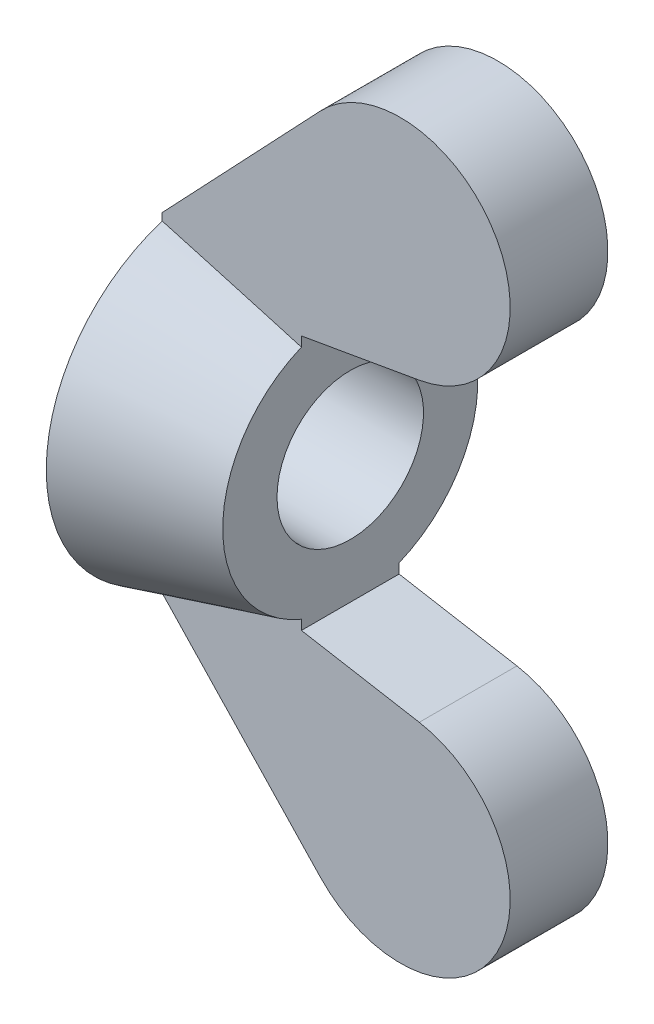
ISO-10303-21;
HEADER;
FILE_DESCRIPTION(('STEP AP214'),'2;1');
FILE_NAME('part.step','',(''),(''),'','','');
FILE_SCHEMA(('AUTOMOTIVE_DESIGN { 1 0 10303 214 1 1 1 1 }'));
ENDSEC;
DATA;
#1=APPLICATION_CONTEXT('core data for automotive mechanical design processes');
#2=APPLICATION_PROTOCOL_DEFINITION('international standard','automotive_design',2000,#1);
#3=PRODUCT_CONTEXT('',#1,'mechanical');
#4=PRODUCT('Part','Part','',(#3));
#5=PRODUCT_RELATED_PRODUCT_CATEGORY('part','',(#4));
#6=PRODUCT_DEFINITION_FORMATION('','',#4);
#7=PRODUCT_DEFINITION_CONTEXT('part definition',#1,'design');
#8=PRODUCT_DEFINITION('design','',#6,#7);
#9=PRODUCT_DEFINITION_SHAPE('','',#8);
#10=(LENGTH_UNIT() NAMED_UNIT(*) SI_UNIT(.MILLI.,.METRE.));
#11=(NAMED_UNIT(*) PLANE_ANGLE_UNIT() SI_UNIT($,.RADIAN.));
#12=(NAMED_UNIT(*) SI_UNIT($,.STERADIAN.) SOLID_ANGLE_UNIT());
#13=UNCERTAINTY_MEASURE_WITH_UNIT(LENGTH_MEASURE(1.E-05),#10,'distance_accuracy_value','');
#14=(GEOMETRIC_REPRESENTATION_CONTEXT(3) GLOBAL_UNCERTAINTY_ASSIGNED_CONTEXT((#13)) GLOBAL_UNIT_ASSIGNED_CONTEXT((#10,
#11,#12)) REPRESENTATION_CONTEXT('',''));
#15=CARTESIAN_POINT('',(0.,0.,0.));
#16=DIRECTION('',(0.,0.,1.));
#17=DIRECTION('',(1.,0.,0.));
#18=AXIS2_PLACEMENT_3D('',#15,#16,#17);
#19=CARTESIAN_POINT('',(3.8,0.,0.));
#20=DIRECTION('',(-1.,0.,0.));
#21=DIRECTION('',(0.,0.,1.));
#22=AXIS2_PLACEMENT_3D('',#19,#20,#21);
#23=CONICAL_SURFACE('',#22,3.48179306876172,0.261799387799153);
#24=CARTESIAN_POINT('',(7.1882117066717,-2.20166060998559,1.33333333333333));
#25=CARTESIAN_POINT('',(7.02558211755386,-2.25259908587351,1.33333333333333));
#26=CARTESIAN_POINT('',(6.86282154843142,-2.30311690747788,1.33333333333333));
#27=CARTESIAN_POINT('',(6.53708112087365,-2.40343743756326,1.33333333333333));
#28=CARTESIAN_POINT('',(6.37410126373637,-2.4532401502571,1.33333333333333));
#29=CARTESIAN_POINT('',(5.88490037565497,-2.60176383814586,1.33333333333333));
#30=CARTESIAN_POINT('',(5.55841155409289,-2.69960237979792,1.33333333333333));
#31=CARTESIAN_POINT('',(4.90494682473719,-2.89357754729106,1.33333333333333));
#32=CARTESIAN_POINT('',(4.57797094049598,-2.98971425270385,1.33333333333333));
#33=CARTESIAN_POINT('',(3.9236451852113,-3.18071175318779,1.33333333333333));
#34=CARTESIAN_POINT('',(3.59629531214881,-3.27557254133513,1.33333333333333));
#35=CARTESIAN_POINT('',(2.81627585629879,-3.5003443113003,1.33333333333333));
#36=CARTESIAN_POINT('',(2.36347786807294,-3.62980934352791,1.33333333333333));
#37=CARTESIAN_POINT('',(1.45748991428026,-3.88738779535643,1.33333333333333));
#38=CARTESIAN_POINT('',(1.00429994220263,-4.01550119202155,1.33333333333333));
#39=CARTESIAN_POINT('',(-0.00374594693617139,-4.29924991744796,1.33333333333333));
#40=CARTESIAN_POINT('',(-0.558672864959987,-4.45463287258272,1.33333333333333));
#41=CARTESIAN_POINT('',(-1.66883544088799,-4.764292907989,1.33333333333333));
#42=CARTESIAN_POINT('',(-2.22407109908928,-4.91856998719429,1.33333333333333));
#43=CARTESIAN_POINT('',(-3.3347443854926,-5.22628496866582,1.33333333333333));
#44=CARTESIAN_POINT('',(-3.89018200199174,-5.37972291319578,1.33333333333333));
#45=CARTESIAN_POINT('',(-5.00123577244357,-5.68594544421749,1.33333333333333));
#46=CARTESIAN_POINT('',(-5.5568519259219,-5.83873003242991,1.33333333333333));
#47=CARTESIAN_POINT('',(-6.1125329906275,-5.99127730226936,1.33333333333333));
#48=B_SPLINE_CURVE_WITH_KNOTS('',3,(#24,#25,#26,#27,#28,#29,#30,#31,#32,#33,#34,#35,#36,#37,#38,
#39,#40,#41,#42,#43,#44,#45,#46,#47),.UNSPECIFIED.,.F.,.F.,(4,2,2,2,2,2,2,2,2,2,2,4),(0.,
0.511259509858175,1.02251600655328,2.04500865819224,3.06745337483093,4.08990363756909,
5.50272920709677,6.91557871230514,8.64438868894977,10.3732003321999,12.1019240853529,
13.8306432829557),.UNSPECIFIED.);
#49=CARTESIAN_POINT('',(3.8,-3.21638076040436,1.33333333333333));
#50=VERTEX_POINT('',#49);
#51=CARTESIAN_POINT('',(0.,-4.29793231940921,1.33333333333333));
#52=VERTEX_POINT('',#51);
#53=EDGE_CURVE('E143',#50,#52,#48,.T.);
#54=ORIENTED_EDGE('',*,*,#53,.F.);
#55=CARTESIAN_POINT('',(3.8,0.,0.));
#56=DIRECTION('',(-1.,0.,0.));
#57=DIRECTION('',(0.,0.,1.));
#58=AXIS2_PLACEMENT_3D('',#55,#56,#57);
#59=CIRCLE('',#58,3.48179306876172);
#60=CARTESIAN_POINT('',(3.8,3.21638076040436,1.33333333333333));
#61=VERTEX_POINT('',#60);
#62=EDGE_CURVE('E226',#50,#61,#59,.T.);
#63=ORIENTED_EDGE('',*,*,#62,.T.);
#64=CARTESIAN_POINT('',(-6.1125329906275,5.99127730226936,1.33333333333333));
#65=CARTESIAN_POINT('',(-5.55682310824559,5.83872217826183,1.33333333333333));
#66=CARTESIAN_POINT('',(-5.00117816850263,5.68592963226838,1.33333333333333));
#67=CARTESIAN_POINT('',(-3.89006799025682,5.37969142432419,1.33333333333333));
#68=CARTESIAN_POINT('',(-3.33460275185776,5.22624576199691,1.33333333333333));
#69=CARTESIAN_POINT('',(-2.22393165809083,4.9185313217443,1.33333333333333));
#70=CARTESIAN_POINT('',(-1.66872579061138,4.76426258755969,1.33333333333333));
#71=CARTESIAN_POINT('',(-0.558619758017499,4.45461779454218,1.33333333333333));
#72=CARTESIAN_POINT('',(-0.00371959439113799,4.29924173036955,1.33333333333333));
#73=CARTESIAN_POINT('',(1.10568997020868,3.98696229708887,1.33333333333333));
#74=CARTESIAN_POINT('',(1.66019934348916,3.83005882952868,1.33333333333333));
#75=CARTESIAN_POINT('',(2.76859928073843,3.51409904821436,1.33333333333333));
#76=CARTESIAN_POINT('',(3.32248985178853,3.35504275937511,1.33333333333333));
#77=CARTESIAN_POINT('',(4.15263119557657,3.11400214875473,1.33333333333333));
#78=CARTESIAN_POINT('',(4.42923763244079,3.03324342044457,1.33333333333333));
#79=CARTESIAN_POINT('',(4.98214229109042,2.87068166747203,1.33333333333333));
#80=CARTESIAN_POINT('',(5.25844051429898,2.7888786476535,1.33333333333333));
#81=CARTESIAN_POINT('',(5.81065153619272,2.62393916667967,1.33333333333333));
#82=CARTESIAN_POINT('',(6.08656431947965,2.54080265381929,1.33333333333333));
#83=CARTESIAN_POINT('',(6.63784053807137,2.37271402559638,1.33333333333333));
#84=CARTESIAN_POINT('',(6.91320396450202,2.28776188116024,1.33333333333333));
#85=CARTESIAN_POINT('',(7.1882117066717,2.20166060998559,1.33333333333333));
#86=B_SPLINE_CURVE_WITH_KNOTS('',3,(#64,#65,#66,#67,#68,#69,#70,#71,#72,#73,#74,#75,#76,#77,#78,
#79,#80,#81,#82,#83,#84,#85),.UNSPECIFIED.,.F.,.F.,(4,2,2,2,2,2,2,2,2,2,4),(0.,1.72880879815737,
3.45761859318671,5.18633741103185,6.91506457069138,8.64390390695709,10.3727232522224,
11.2371855449363,12.101643829372,12.9661357138843,13.8306414518526),.UNSPECIFIED.);
#87=CARTESIAN_POINT('',(0.,4.29793231940921,1.33333333333333));
#88=VERTEX_POINT('',#87);
#89=EDGE_CURVE('E211',#88,#61,#86,.T.);
#90=ORIENTED_EDGE('',*,*,#89,.F.);
#91=CARTESIAN_POINT('',(0.,0.,0.));
#92=DIRECTION('',(-1.,0.,0.));
#93=DIRECTION('',(0.,0.,1.));
#94=AXIS2_PLACEMENT_3D('',#91,#92,#93);
#95=CIRCLE('',#94,4.5);
#96=EDGE_CURVE('E229',#52,#88,#95,.T.);
#97=ORIENTED_EDGE('',*,*,#96,.F.);
#98=EDGE_LOOP('',(#54,#63,#90,#97));
#99=FACE_BOUND('',#98,.T.);
#100=ADVANCED_FACE('F34',(#99),#23,.T.);
#101=CARTESIAN_POINT('',(3.8,3.21638076040436,-1.33333333333333));
#102=VERTEX_POINT('',#101);
#103=CARTESIAN_POINT('',(3.8,-3.21638076040436,-1.33333333333333));
#104=VERTEX_POINT('',#103);
#105=EDGE_CURVE('E227',#102,#104,#59,.T.);
#106=ORIENTED_EDGE('',*,*,#105,.T.);
#107=CARTESIAN_POINT('',(7.1882117066717,-2.20166060998559,-1.33333333333333));
#108=CARTESIAN_POINT('',(7.02558211755386,-2.25259908587351,-1.33333333333333));
#109=CARTESIAN_POINT('',(6.86282154843142,-2.30311690747788,-1.33333333333333));
#110=CARTESIAN_POINT('',(6.53708112087365,-2.40343743756326,-1.33333333333333));
#111=CARTESIAN_POINT('',(6.37410126373637,-2.4532401502571,-1.33333333333333));
#112=CARTESIAN_POINT('',(5.88490037565497,-2.60176383814586,-1.33333333333333));
#113=CARTESIAN_POINT('',(5.55841155409289,-2.69960237979792,-1.33333333333333));
#114=CARTESIAN_POINT('',(4.90494682473719,-2.89357754729106,-1.33333333333333));
#115=CARTESIAN_POINT('',(4.57797094049598,-2.98971425270385,-1.33333333333333));
#116=CARTESIAN_POINT('',(3.9236451852113,-3.18071175318779,-1.33333333333333));
#117=CARTESIAN_POINT('',(3.59629531214881,-3.27557254133513,-1.33333333333333));
#118=CARTESIAN_POINT('',(2.81627585629879,-3.5003443113003,-1.33333333333333));
#119=CARTESIAN_POINT('',(2.36347786807294,-3.62980934352791,-1.33333333333333));
#120=CARTESIAN_POINT('',(1.45748991428026,-3.88738779535643,-1.33333333333333));
#121=CARTESIAN_POINT('',(1.00429994220263,-4.01550119202155,-1.33333333333333));
#122=CARTESIAN_POINT('',(-0.00374594693617139,-4.29924991744796,-1.33333333333333));
#123=CARTESIAN_POINT('',(-0.558672864959987,-4.45463287258272,-1.33333333333333));
#124=CARTESIAN_POINT('',(-1.66883544088799,-4.764292907989,-1.33333333333333));
#125=CARTESIAN_POINT('',(-2.22407109908928,-4.91856998719429,-1.33333333333333));
#126=CARTESIAN_POINT('',(-3.3347443854926,-5.22628496866582,-1.33333333333333));
#127=CARTESIAN_POINT('',(-3.89018200199174,-5.37972291319578,-1.33333333333333));
#128=CARTESIAN_POINT('',(-5.00123577244357,-5.68594544421749,-1.33333333333333));
#129=CARTESIAN_POINT('',(-5.5568519259219,-5.83873003242991,-1.33333333333333));
#130=CARTESIAN_POINT('',(-6.1125329906275,-5.99127730226936,-1.33333333333333));
#131=B_SPLINE_CURVE_WITH_KNOTS('',3,(#107,#108,#109,#110,#111,#112,#113,#114,#115,#116,#117,
#118,#119,#120,#121,#122,#123,#124,#125,#126,#127,#128,#129,#130),.UNSPECIFIED.,.F.,.F.,(4,2,2,
2,2,2,2,2,2,2,2,4),(0.,0.511259509858175,1.02251600655328,2.04500865819224,3.06745337483093,
4.08990363756909,5.50272920709677,6.91557871230514,8.64438868894977,10.3732003321999,
12.1019240853529,13.8306432829557),.UNSPECIFIED.);
#132=CARTESIAN_POINT('',(0.,-4.29793231940921,-1.33333333333333));
#133=VERTEX_POINT('',#132);
#134=EDGE_CURVE('E133',#104,#133,#131,.T.);
#135=ORIENTED_EDGE('',*,*,#134,.T.);
#136=CARTESIAN_POINT('',(0.,4.29793231940921,-1.33333333333333));
#137=VERTEX_POINT('',#136);
#138=EDGE_CURVE('E42',#137,#133,#95,.T.);
#139=ORIENTED_EDGE('',*,*,#138,.F.);
#140=CARTESIAN_POINT('',(-6.1125329906275,5.99127730226936,-1.33333333333333));
#141=CARTESIAN_POINT('',(-5.55682310824559,5.83872217826183,-1.33333333333333));
#142=CARTESIAN_POINT('',(-5.00117816850263,5.68592963226838,-1.33333333333333));
#143=CARTESIAN_POINT('',(-3.89006799025682,5.37969142432419,-1.33333333333333));
#144=CARTESIAN_POINT('',(-3.33460275185776,5.22624576199691,-1.33333333333333));
#145=CARTESIAN_POINT('',(-2.22393165809083,4.9185313217443,-1.33333333333333));
#146=CARTESIAN_POINT('',(-1.66872579061138,4.76426258755969,-1.33333333333333));
#147=CARTESIAN_POINT('',(-0.558619758017499,4.45461779454218,-1.33333333333333));
#148=CARTESIAN_POINT('',(-0.00371959439113799,4.29924173036955,-1.33333333333333));
#149=CARTESIAN_POINT('',(1.10568997020868,3.98696229708887,-1.33333333333333));
#150=CARTESIAN_POINT('',(1.66019934348916,3.83005882952868,-1.33333333333333));
#151=CARTESIAN_POINT('',(2.76859928073843,3.51409904821436,-1.33333333333333));
#152=CARTESIAN_POINT('',(3.32248985178853,3.35504275937511,-1.33333333333333));
#153=CARTESIAN_POINT('',(4.15263119557657,3.11400214875473,-1.33333333333333));
#154=CARTESIAN_POINT('',(4.42923763244079,3.03324342044457,-1.33333333333333));
#155=CARTESIAN_POINT('',(4.98214229109042,2.87068166747203,-1.33333333333333));
#156=CARTESIAN_POINT('',(5.25844051429898,2.7888786476535,-1.33333333333333));
#157=CARTESIAN_POINT('',(5.81065153619272,2.62393916667967,-1.33333333333333));
#158=CARTESIAN_POINT('',(6.08656431947965,2.54080265381929,-1.33333333333333));
#159=CARTESIAN_POINT('',(6.63784053807137,2.37271402559638,-1.33333333333333));
#160=CARTESIAN_POINT('',(6.91320396450202,2.28776188116024,-1.33333333333333));
#161=CARTESIAN_POINT('',(7.1882117066717,2.20166060998559,-1.33333333333333));
#162=B_SPLINE_CURVE_WITH_KNOTS('',3,(#140,#141,#142,#143,#144,#145,#146,#147,#148,#149,#150,
#151,#152,#153,#154,#155,#156,#157,#158,#159,#160,#161),.UNSPECIFIED.,.F.,.F.,(4,2,2,2,2,2,2,2,
2,2,4),(0.,1.72880879815737,3.45761859318671,5.18633741103185,6.91506457069138,8.64390390695709,
10.3727232522224,11.2371855449363,12.101643829372,12.9661357138843,13.8306414518526),.UNSPECIFIED.);
#163=EDGE_CURVE('E219',#137,#102,#162,.T.);
#164=ORIENTED_EDGE('',*,*,#163,.T.);
#165=EDGE_LOOP('',(#106,#135,#139,#164));
#166=FACE_BOUND('',#165,.T.);
#167=ADVANCED_FACE('F183',(#166),#23,.T.);
#168=CARTESIAN_POINT('',(0.,0.,0.));
#169=DIRECTION('',(-1.,0.,0.));
#170=DIRECTION('',(0.,0.,1.));
#171=AXIS2_PLACEMENT_3D('',#168,#169,#170);
#172=CYLINDRICAL_SURFACE('',#171,2.);
#173=CARTESIAN_POINT('',(3.8,0.,0.));
#174=DIRECTION('',(-1.,0.,0.));
#175=DIRECTION('',(0.,0.,1.));
#176=AXIS2_PLACEMENT_3D('',#173,#174,#175);
#177=CIRCLE('',#176,2.);
#178=CARTESIAN_POINT('',(3.8,0.,2.));
#179=VERTEX_POINT('',#178);
#180=EDGE_CURVE('E218',#179,#179,#177,.T.);
#181=ORIENTED_EDGE('',*,*,#180,.F.);
#182=EDGE_LOOP('',(#181));
#183=FACE_BOUND('',#182,.T.);
#184=CARTESIAN_POINT('',(0.,0.,0.));
#185=DIRECTION('',(-1.,0.,0.));
#186=DIRECTION('',(0.,0.,1.));
#187=AXIS2_PLACEMENT_3D('',#184,#185,#186);
#188=CIRCLE('',#187,2.);
#189=CARTESIAN_POINT('',(0.,0.,2.));
#190=VERTEX_POINT('',#189);
#191=EDGE_CURVE('E11',#190,#190,#188,.T.);
#192=ORIENTED_EDGE('',*,*,#191,.T.);
#193=EDGE_LOOP('',(#192));
#194=FACE_BOUND('',#193,.T.);
#195=ADVANCED_FACE('F36',(#183,#194),#172,.F.);
#196=CARTESIAN_POINT('',(0.,0.,-2.));
#197=DIRECTION('',(1.,0.,0.));
#198=DIRECTION('',(0.,0.,-1.));
#199=AXIS2_PLACEMENT_3D('',#196,#197,#198);
#200=PLANE('',#199);
#201=ORIENTED_EDGE('',*,*,#191,.F.);
#202=EDGE_LOOP('',(#201));
#203=FACE_BOUND('',#202,.T.);
#204=DIRECTION('',(0.,1.,0.));
#205=VECTOR('',#204,1.);
#206=CARTESIAN_POINT('',(0.,-4.5,-1.33333333333333));
#207=LINE('',#206,#205);
#208=CARTESIAN_POINT('',(0.,-4.5,-1.33333333333333));
#209=VERTEX_POINT('',#208);
#210=EDGE_CURVE('E49',#209,#133,#207,.T.);
#211=ORIENTED_EDGE('',*,*,#210,.F.);
#212=DIRECTION('',(0.,0.,-1.));
#213=VECTOR('',#212,1.);
#214=CARTESIAN_POINT('',(0.,-4.5,1.33333333333333));
#215=LINE('',#214,#213);
#216=CARTESIAN_POINT('',(0.,-4.5,1.33333333333333));
#217=VERTEX_POINT('',#216);
#218=EDGE_CURVE('E124',#217,#209,#215,.T.);
#219=ORIENTED_EDGE('',*,*,#218,.F.);
#220=DIRECTION('',(0.,1.,0.));
#221=VECTOR('',#220,1.);
#222=CARTESIAN_POINT('',(0.,-4.5,1.33333333333333));
#223=LINE('',#222,#221);
#224=EDGE_CURVE('E127',#217,#52,#223,.T.);
#225=ORIENTED_EDGE('',*,*,#224,.T.);
#226=ORIENTED_EDGE('',*,*,#96,.T.);
#227=DIRECTION('',(0.,-1.,0.));
#228=VECTOR('',#227,1.);
#229=CARTESIAN_POINT('',(0.,4.5,1.33333333333333));
#230=LINE('',#229,#228);
#231=CARTESIAN_POINT('',(0.,4.5,1.33333333333333));
#232=VERTEX_POINT('',#231);
#233=EDGE_CURVE('E234',#232,#88,#230,.T.);
#234=ORIENTED_EDGE('',*,*,#233,.F.);
#235=DIRECTION('',(0.,0.,-1.));
#236=VECTOR('',#235,1.);
#237=CARTESIAN_POINT('',(0.,4.5,1.33333333333333));
#238=LINE('',#237,#236);
#239=CARTESIAN_POINT('',(0.,4.5,-1.33333333333333));
#240=VERTEX_POINT('',#239);
#241=EDGE_CURVE('E256',#232,#240,#238,.T.);
#242=ORIENTED_EDGE('',*,*,#241,.T.);
#243=DIRECTION('',(0.,-1.,0.));
#244=VECTOR('',#243,1.);
#245=CARTESIAN_POINT('',(0.,4.5,-1.33333333333333));
#246=LINE('',#245,#244);
#247=EDGE_CURVE('E257',#240,#137,#246,.T.);
#248=ORIENTED_EDGE('',*,*,#247,.T.);
#249=ORIENTED_EDGE('',*,*,#138,.T.);
#250=EDGE_LOOP('',(#211,#219,#225,#226,#234,#242,#248,#249));
#251=FACE_BOUND('',#250,.T.);
#252=ADVANCED_FACE('F126',(#203,#251),#200,.F.);
#253=CARTESIAN_POINT('',(3.8,0.,-3.48179306876172));
#254=DIRECTION('',(-1.,0.,0.));
#255=DIRECTION('',(0.,0.,1.));
#256=AXIS2_PLACEMENT_3D('',#253,#254,#255);
#257=PLANE('',#256);
#258=ORIENTED_EDGE('',*,*,#180,.T.);
#259=EDGE_LOOP('',(#258));
#260=FACE_BOUND('',#259,.T.);
#261=ORIENTED_EDGE('',*,*,#62,.F.);
#262=DIRECTION('',(0.,-1.,0.));
#263=VECTOR('',#262,1.);
#264=CARTESIAN_POINT('',(3.8,-2.,1.33333333333333));
#265=LINE('',#264,#263);
#266=CARTESIAN_POINT('',(3.8,-3.48179306876172,1.33333333333333));
#267=VERTEX_POINT('',#266);
#268=EDGE_CURVE('E154',#50,#267,#265,.T.);
#269=ORIENTED_EDGE('',*,*,#268,.T.);
#270=DIRECTION('',(0.,0.,-1.));
#271=VECTOR('',#270,1.);
#272=CARTESIAN_POINT('',(3.8,-3.48179306876172,1.33333333333333));
#273=LINE('',#272,#271);
#274=CARTESIAN_POINT('',(3.8,-3.48179306876172,-1.33333333333333));
#275=VERTEX_POINT('',#274);
#276=EDGE_CURVE('E156',#267,#275,#273,.T.);
#277=ORIENTED_EDGE('',*,*,#276,.T.);
#278=DIRECTION('',(0.,-1.,0.));
#279=VECTOR('',#278,1.);
#280=CARTESIAN_POINT('',(3.8,-2.,-1.33333333333333));
#281=LINE('',#280,#279);
#282=EDGE_CURVE('E144',#104,#275,#281,.T.);
#283=ORIENTED_EDGE('',*,*,#282,.F.);
#284=ORIENTED_EDGE('',*,*,#105,.F.);
#285=DIRECTION('',(0.,1.,0.));
#286=VECTOR('',#285,1.);
#287=CARTESIAN_POINT('',(3.8,2.,-1.33333333333333));
#288=LINE('',#287,#286);
#289=CARTESIAN_POINT('',(3.8,3.48179306876172,-1.33333333333333));
#290=VERTEX_POINT('',#289);
#291=EDGE_CURVE('E57',#102,#290,#288,.T.);
#292=ORIENTED_EDGE('',*,*,#291,.T.);
#293=DIRECTION('',(0.,0.,-1.));
#294=VECTOR('',#293,1.);
#295=CARTESIAN_POINT('',(3.8,3.48179306876172,1.33333333333333));
#296=LINE('',#295,#294);
#297=CARTESIAN_POINT('',(3.8,3.48179306876172,1.33333333333333));
#298=VERTEX_POINT('',#297);
#299=EDGE_CURVE('E247',#298,#290,#296,.T.);
#300=ORIENTED_EDGE('',*,*,#299,.F.);
#301=DIRECTION('',(0.,1.,0.));
#302=VECTOR('',#301,1.);
#303=CARTESIAN_POINT('',(3.8,2.,1.33333333333333));
#304=LINE('',#303,#302);
#305=EDGE_CURVE('E241',#61,#298,#304,.T.);
#306=ORIENTED_EDGE('',*,*,#305,.F.);
#307=EDGE_LOOP('',(#261,#269,#277,#283,#284,#292,#300,#306));
#308=FACE_BOUND('',#307,.T.);
#309=ADVANCED_FACE('F206',(#260,#308),#257,.F.);
#310=CARTESIAN_POINT('',(6.5,7.,1.33333333333333));
#311=DIRECTION('',(0.,0.,-1.));
#312=DIRECTION('',(-1.,0.,0.));
#313=AXIS2_PLACEMENT_3D('',#310,#311,#312);
#314=PLANE('',#313);
#315=ORIENTED_EDGE('',*,*,#233,.T.);
#316=ORIENTED_EDGE('',*,*,#89,.T.);
#317=ORIENTED_EDGE('',*,*,#305,.T.);
#318=DIRECTION('',(0.985024443395031,0.172414749700566,0.));
#319=VECTOR('',#318,1.);
#320=CARTESIAN_POINT('',(7.0172442491017,4.04492666981491,1.33333333333333));
#321=LINE('',#320,#319);
#322=CARTESIAN_POINT('',(7.0172442491017,4.04492666981491,1.33333333333333));
#323=VERTEX_POINT('',#322);
#324=EDGE_CURVE('E249',#298,#323,#321,.T.);
#325=ORIENTED_EDGE('',*,*,#324,.T.);
#326=CARTESIAN_POINT('',(6.5,7.,1.33333333333333));
#327=DIRECTION('',(0.,0.,1.));
#328=DIRECTION('',(-1.,0.,0.));
#329=AXIS2_PLACEMENT_3D('',#326,#327,#328);
#330=CIRCLE('',#329,3.);
#331=CARTESIAN_POINT('',(4.32192228685748,9.06300205417054,1.33333333333333));
#332=VERTEX_POINT('',#331);
#333=EDGE_CURVE('E251',#323,#332,#330,.T.);
#334=ORIENTED_EDGE('',*,*,#333,.T.);
#335=DIRECTION('',(-0.68766735139018,-0.726025904380839,0.));
#336=VECTOR('',#335,1.);
#337=CARTESIAN_POINT('',(0.,4.5,1.33333333333333));
#338=LINE('',#337,#336);
#339=EDGE_CURVE('E239',#332,#232,#338,.T.);
#340=ORIENTED_EDGE('',*,*,#339,.T.);
#341=EDGE_LOOP('',(#315,#316,#317,#325,#334,#340));
#342=FACE_BOUND('',#341,.T.);
#343=ADVANCED_FACE('F201',(#342),#314,.F.);
#344=CARTESIAN_POINT('',(6.5,7.,-1.33333333333333));
#345=DIRECTION('',(0.,0.,-1.));
#346=DIRECTION('',(-1.,0.,0.));
#347=AXIS2_PLACEMENT_3D('',#344,#345,#346);
#348=PLANE('',#347);
#349=ORIENTED_EDGE('',*,*,#163,.F.);
#350=ORIENTED_EDGE('',*,*,#247,.F.);
#351=DIRECTION('',(-0.68766735139018,-0.726025904380839,0.));
#352=VECTOR('',#351,1.);
#353=CARTESIAN_POINT('',(0.,4.5,-1.33333333333333));
#354=LINE('',#353,#352);
#355=CARTESIAN_POINT('',(4.32192228685748,9.06300205417054,-1.33333333333333));
#356=VERTEX_POINT('',#355);
#357=EDGE_CURVE('E242',#356,#240,#354,.T.);
#358=ORIENTED_EDGE('',*,*,#357,.F.);
#359=CARTESIAN_POINT('',(6.5,7.,-1.33333333333333));
#360=DIRECTION('',(0.,0.,1.));
#361=DIRECTION('',(-1.,0.,0.));
#362=AXIS2_PLACEMENT_3D('',#359,#360,#361);
#363=CIRCLE('',#362,3.);
#364=CARTESIAN_POINT('',(7.0172442491017,4.04492666981491,-1.33333333333333));
#365=VERTEX_POINT('',#364);
#366=EDGE_CURVE('E262',#365,#356,#363,.T.);
#367=ORIENTED_EDGE('',*,*,#366,.F.);
#368=DIRECTION('',(0.985024443395031,0.172414749700566,0.));
#369=VECTOR('',#368,1.);
#370=CARTESIAN_POINT('',(7.0172442491017,4.04492666981491,-1.33333333333333));
#371=LINE('',#370,#369);
#372=EDGE_CURVE('E260',#290,#365,#371,.T.);
#373=ORIENTED_EDGE('',*,*,#372,.F.);
#374=ORIENTED_EDGE('',*,*,#291,.F.);
#375=EDGE_LOOP('',(#349,#350,#358,#367,#373,#374));
#376=FACE_BOUND('',#375,.T.);
#377=ADVANCED_FACE('F205',(#376),#348,.T.);
#378=CARTESIAN_POINT('',(7.0172442491017,4.04492666981491,1.33333333333333));
#379=DIRECTION('',(-0.172414749700566,0.985024443395031,0.));
#380=DIRECTION('',(-0.985024443395031,-0.172414749700566,0.));
#381=AXIS2_PLACEMENT_3D('',#378,#379,#380);
#382=PLANE('',#381);
#383=ORIENTED_EDGE('',*,*,#372,.T.);
#384=DIRECTION('',(0.,0.,-1.));
#385=VECTOR('',#384,1.);
#386=CARTESIAN_POINT('',(7.0172442491017,4.04492666981491,1.33333333333333));
#387=LINE('',#386,#385);
#388=EDGE_CURVE('E270',#323,#365,#387,.T.);
#389=ORIENTED_EDGE('',*,*,#388,.F.);
#390=ORIENTED_EDGE('',*,*,#324,.F.);
#391=ORIENTED_EDGE('',*,*,#299,.T.);
#392=EDGE_LOOP('',(#383,#389,#390,#391));
#393=FACE_BOUND('',#392,.T.);
#394=ADVANCED_FACE('F283',(#393),#382,.F.);
#395=CARTESIAN_POINT('',(6.5,7.,1.33333333333333));
#396=DIRECTION('',(0.,0.,-1.));
#397=DIRECTION('',(-1.,0.,0.));
#398=AXIS2_PLACEMENT_3D('',#395,#396,#397);
#399=CYLINDRICAL_SURFACE('',#398,3.);
#400=ORIENTED_EDGE('',*,*,#366,.T.);
#401=DIRECTION('',(0.,0.,-1.));
#402=VECTOR('',#401,1.);
#403=CARTESIAN_POINT('',(4.32192228685748,9.06300205417054,1.33333333333333));
#404=LINE('',#403,#402);
#405=EDGE_CURVE('E267',#332,#356,#404,.T.);
#406=ORIENTED_EDGE('',*,*,#405,.F.);
#407=ORIENTED_EDGE('',*,*,#333,.F.);
#408=ORIENTED_EDGE('',*,*,#388,.T.);
#409=EDGE_LOOP('',(#400,#406,#407,#408));
#410=FACE_BOUND('',#409,.T.);
#411=ADVANCED_FACE('F286',(#410),#399,.T.);
#412=CARTESIAN_POINT('',(0.,4.5,1.33333333333333));
#413=DIRECTION('',(0.726025904380839,-0.68766735139018,0.));
#414=DIRECTION('',(0.68766735139018,0.726025904380839,0.));
#415=AXIS2_PLACEMENT_3D('',#412,#413,#414);
#416=PLANE('',#415);
#417=ORIENTED_EDGE('',*,*,#357,.T.);
#418=ORIENTED_EDGE('',*,*,#241,.F.);
#419=ORIENTED_EDGE('',*,*,#339,.F.);
#420=ORIENTED_EDGE('',*,*,#405,.T.);
#421=EDGE_LOOP('',(#417,#418,#419,#420));
#422=FACE_BOUND('',#421,.T.);
#423=ADVANCED_FACE('F289',(#422),#416,.F.);
#424=CARTESIAN_POINT('',(6.5,-7.,1.33333333333333));
#425=DIRECTION('',(0.,0.,-1.));
#426=DIRECTION('',(-1.,0.,0.));
#427=AXIS2_PLACEMENT_3D('',#424,#425,#426);
#428=PLANE('',#427);
#429=ORIENTED_EDGE('',*,*,#268,.F.);
#430=ORIENTED_EDGE('',*,*,#53,.T.);
#431=ORIENTED_EDGE('',*,*,#224,.F.);
#432=DIRECTION('',(-0.68766735139018,0.726025904380839,0.));
#433=VECTOR('',#432,1.);
#434=CARTESIAN_POINT('',(0.,-4.5,1.33333333333333));
#435=LINE('',#434,#433);
#436=CARTESIAN_POINT('',(4.32192228685748,-9.06300205417054,1.33333333333333));
#437=VERTEX_POINT('',#436);
#438=EDGE_CURVE('E140',#437,#217,#435,.T.);
#439=ORIENTED_EDGE('',*,*,#438,.F.);
#440=CARTESIAN_POINT('',(6.5,-7.,1.33333333333333));
#441=DIRECTION('',(0.,0.,-1.));
#442=DIRECTION('',(-1.,0.,0.));
#443=AXIS2_PLACEMENT_3D('',#440,#441,#442);
#444=CIRCLE('',#443,3.);
#445=CARTESIAN_POINT('',(7.0172442491017,-4.04492666981491,1.33333333333333));
#446=VERTEX_POINT('',#445);
#447=EDGE_CURVE('E147',#446,#437,#444,.T.);
#448=ORIENTED_EDGE('',*,*,#447,.F.);
#449=DIRECTION('',(0.985024443395031,-0.172414749700566,0.));
#450=VECTOR('',#449,1.);
#451=CARTESIAN_POINT('',(7.0172442491017,-4.04492666981491,1.33333333333333));
#452=LINE('',#451,#450);
#453=EDGE_CURVE('E149',#267,#446,#452,.T.);
#454=ORIENTED_EDGE('',*,*,#453,.F.);
#455=EDGE_LOOP('',(#429,#430,#431,#439,#448,#454));
#456=FACE_BOUND('',#455,.T.);
#457=ADVANCED_FACE('F138',(#456),#428,.F.);
#458=CARTESIAN_POINT('',(6.5,-7.,-1.33333333333333));
#459=DIRECTION('',(0.,0.,-1.));
#460=DIRECTION('',(-1.,0.,0.));
#461=AXIS2_PLACEMENT_3D('',#458,#459,#460);
#462=PLANE('',#461);
#463=ORIENTED_EDGE('',*,*,#134,.F.);
#464=ORIENTED_EDGE('',*,*,#282,.T.);
#465=DIRECTION('',(0.985024443395031,-0.172414749700566,0.));
#466=VECTOR('',#465,1.);
#467=CARTESIAN_POINT('',(7.0172442491017,-4.04492666981491,-1.33333333333333));
#468=LINE('',#467,#466);
#469=CARTESIAN_POINT('',(7.0172442491017,-4.04492666981491,-1.33333333333333));
#470=VERTEX_POINT('',#469);
#471=EDGE_CURVE('E163',#275,#470,#468,.T.);
#472=ORIENTED_EDGE('',*,*,#471,.T.);
#473=CARTESIAN_POINT('',(6.5,-7.,-1.33333333333333));
#474=DIRECTION('',(0.,0.,-1.));
#475=DIRECTION('',(-1.,0.,0.));
#476=AXIS2_PLACEMENT_3D('',#473,#474,#475);
#477=CIRCLE('',#476,3.);
#478=CARTESIAN_POINT('',(4.32192228685748,-9.06300205417054,-1.33333333333333));
#479=VERTEX_POINT('',#478);
#480=EDGE_CURVE('E160',#470,#479,#477,.T.);
#481=ORIENTED_EDGE('',*,*,#480,.T.);
#482=DIRECTION('',(-0.68766735139018,0.726025904380839,0.));
#483=VECTOR('',#482,1.);
#484=CARTESIAN_POINT('',(0.,-4.5,-1.33333333333333));
#485=LINE('',#484,#483);
#486=EDGE_CURVE('E158',#479,#209,#485,.T.);
#487=ORIENTED_EDGE('',*,*,#486,.T.);
#488=ORIENTED_EDGE('',*,*,#210,.T.);
#489=EDGE_LOOP('',(#463,#464,#472,#481,#487,#488));
#490=FACE_BOUND('',#489,.T.);
#491=ADVANCED_FACE('F186',(#490),#462,.T.);
#492=CARTESIAN_POINT('',(0.,-4.5,1.33333333333333));
#493=DIRECTION('',(-0.726025904380839,-0.68766735139018,0.));
#494=DIRECTION('',(0.68766735139018,-0.726025904380839,0.));
#495=AXIS2_PLACEMENT_3D('',#492,#493,#494);
#496=PLANE('',#495);
#497=ORIENTED_EDGE('',*,*,#486,.F.);
#498=DIRECTION('',(0.,0.,-1.));
#499=VECTOR('',#498,1.);
#500=CARTESIAN_POINT('',(4.32192228685748,-9.06300205417054,1.33333333333333));
#501=LINE('',#500,#499);
#502=EDGE_CURVE('E134',#437,#479,#501,.T.);
#503=ORIENTED_EDGE('',*,*,#502,.F.);
#504=ORIENTED_EDGE('',*,*,#438,.T.);
#505=ORIENTED_EDGE('',*,*,#218,.T.);
#506=EDGE_LOOP('',(#497,#503,#504,#505));
#507=FACE_BOUND('',#506,.T.);
#508=ADVANCED_FACE('F146',(#507),#496,.T.);
#509=CARTESIAN_POINT('',(6.5,-7.,1.33333333333333));
#510=DIRECTION('',(0.,0.,-1.));
#511=DIRECTION('',(-1.,0.,0.));
#512=AXIS2_PLACEMENT_3D('',#509,#510,#511);
#513=CYLINDRICAL_SURFACE('',#512,3.);
#514=ORIENTED_EDGE('',*,*,#480,.F.);
#515=DIRECTION('',(0.,0.,-1.));
#516=VECTOR('',#515,1.);
#517=CARTESIAN_POINT('',(7.0172442491017,-4.04492666981491,1.33333333333333));
#518=LINE('',#517,#516);
#519=EDGE_CURVE('E169',#446,#470,#518,.T.);
#520=ORIENTED_EDGE('',*,*,#519,.F.);
#521=ORIENTED_EDGE('',*,*,#447,.T.);
#522=ORIENTED_EDGE('',*,*,#502,.T.);
#523=EDGE_LOOP('',(#514,#520,#521,#522));
#524=FACE_BOUND('',#523,.T.);
#525=ADVANCED_FACE('F194',(#524),#513,.T.);
#526=CARTESIAN_POINT('',(7.0172442491017,-4.04492666981491,1.33333333333333));
#527=DIRECTION('',(0.172414749700566,0.985024443395031,0.));
#528=DIRECTION('',(-0.985024443395031,0.172414749700566,0.));
#529=AXIS2_PLACEMENT_3D('',#526,#527,#528);
#530=PLANE('',#529);
#531=ORIENTED_EDGE('',*,*,#471,.F.);
#532=ORIENTED_EDGE('',*,*,#276,.F.);
#533=ORIENTED_EDGE('',*,*,#453,.T.);
#534=ORIENTED_EDGE('',*,*,#519,.T.);
#535=EDGE_LOOP('',(#531,#532,#533,#534));
#536=FACE_BOUND('',#535,.T.);
#537=ADVANCED_FACE('F191',(#536),#530,.T.);
#538=CLOSED_SHELL('',(#100,#167,#195,#252,#309,#343,#377,#394,#411,#423,#457,#491,#508,#525,#537));
#539=MANIFOLD_SOLID_BREP('B2',#538);
#540=ADVANCED_BREP_SHAPE_REPRESENTATION('',(#18,#539),#14);
#541=SHAPE_DEFINITION_REPRESENTATION(#9,#540);
ENDSEC;
END-ISO-10303-21;
